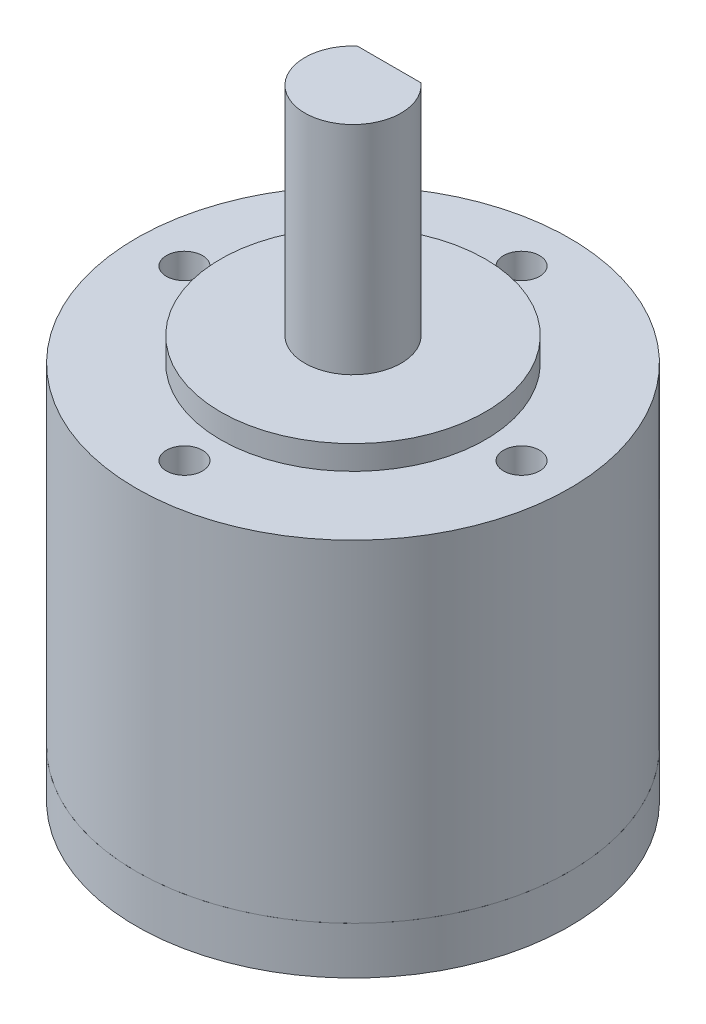
ISO-10303-21;
HEADER;
FILE_DESCRIPTION(('STEP AP214'),'2;1');
FILE_NAME('part.step','',(''),(''),'','','');
FILE_SCHEMA(('AUTOMOTIVE_DESIGN { 1 0 10303 214 1 1 1 1 }'));
ENDSEC;
DATA;
#1=APPLICATION_CONTEXT('core data for automotive mechanical design processes');
#2=APPLICATION_PROTOCOL_DEFINITION('international standard','automotive_design',2000,#1);
#3=PRODUCT_CONTEXT('',#1,'mechanical');
#4=PRODUCT('Part','Part','',(#3));
#5=PRODUCT_RELATED_PRODUCT_CATEGORY('part','',(#4));
#6=PRODUCT_DEFINITION_FORMATION('','',#4);
#7=PRODUCT_DEFINITION_CONTEXT('part definition',#1,'design');
#8=PRODUCT_DEFINITION('design','',#6,#7);
#9=PRODUCT_DEFINITION_SHAPE('','',#8);
#10=(LENGTH_UNIT() NAMED_UNIT(*) SI_UNIT(.MILLI.,.METRE.));
#11=(NAMED_UNIT(*) PLANE_ANGLE_UNIT() SI_UNIT($,.RADIAN.));
#12=(NAMED_UNIT(*) SI_UNIT($,.STERADIAN.) SOLID_ANGLE_UNIT());
#13=UNCERTAINTY_MEASURE_WITH_UNIT(LENGTH_MEASURE(1.E-05),#10,'distance_accuracy_value','');
#14=(GEOMETRIC_REPRESENTATION_CONTEXT(3) GLOBAL_UNCERTAINTY_ASSIGNED_CONTEXT((#13)) GLOBAL_UNIT_ASSIGNED_CONTEXT((#10,
#11,#12)) REPRESENTATION_CONTEXT('',''));
#15=CARTESIAN_POINT('',(0.,0.,0.));
#16=DIRECTION('',(0.,0.,1.));
#17=DIRECTION('',(1.,0.,0.));
#18=AXIS2_PLACEMENT_3D('',#15,#16,#17);
#19=CARTESIAN_POINT('',(0.,-17.7165,0.));
#20=DIRECTION('',(0.,1.,0.));
#21=DIRECTION('',(0.,0.,1.));
#22=AXIS2_PLACEMENT_3D('',#19,#20,#21);
#23=CYLINDRICAL_SURFACE('',#22,4.);
#24=CARTESIAN_POINT('',(0.,-17.7165,0.));
#25=DIRECTION('',(0.,1.,0.));
#26=DIRECTION('',(0.,0.,1.));
#27=AXIS2_PLACEMENT_3D('',#24,#25,#26);
#28=CIRCLE('',#27,4.);
#29=CARTESIAN_POINT('',(0.,-17.7165,4.));
#30=VERTEX_POINT('',#29);
#31=EDGE_CURVE('E80',#30,#30,#28,.T.);
#32=ORIENTED_EDGE('',*,*,#31,.F.);
#33=EDGE_LOOP('',(#32));
#34=FACE_BOUND('',#33,.T.);
#35=CARTESIAN_POINT('',(0.,-11.9665,0.));
#36=DIRECTION('',(0.,1.,0.));
#37=DIRECTION('',(0.,0.,1.));
#38=AXIS2_PLACEMENT_3D('',#35,#36,#37);
#39=CIRCLE('',#38,4.);
#40=CARTESIAN_POINT('',(0.,-11.9665,4.));
#41=VERTEX_POINT('',#40);
#42=EDGE_CURVE('E50',#41,#41,#39,.F.);
#43=ORIENTED_EDGE('',*,*,#42,.F.);
#44=EDGE_LOOP('',(#43));
#45=FACE_BOUND('',#44,.T.);
#46=ADVANCED_FACE('F46',(#34,#45),#23,.F.);
#47=CARTESIAN_POINT('',(0.,-17.7165,0.));
#48=DIRECTION('',(0.,1.,0.));
#49=DIRECTION('',(0.,0.,1.));
#50=AXIS2_PLACEMENT_3D('',#47,#48,#49);
#51=CYLINDRICAL_SURFACE('',#50,18.);
#52=CARTESIAN_POINT('',(0.,-17.7165,0.));
#53=DIRECTION('',(0.,-1.,0.));
#54=DIRECTION('',(0.,0.,-1.));
#55=AXIS2_PLACEMENT_3D('',#52,#53,#54);
#56=CIRCLE('',#55,18.);
#57=CARTESIAN_POINT('',(0.,-17.7165,-18.));
#58=VERTEX_POINT('',#57);
#59=EDGE_CURVE('E54',#58,#58,#56,.T.);
#60=ORIENTED_EDGE('',*,*,#59,.F.);
#61=EDGE_LOOP('',(#60));
#62=FACE_BOUND('',#61,.T.);
#63=CARTESIAN_POINT('',(0.,-13.7795,0.));
#64=DIRECTION('',(0.,-1.,0.));
#65=DIRECTION('',(0.,0.,-1.));
#66=AXIS2_PLACEMENT_3D('',#63,#64,#65);
#67=CIRCLE('',#66,18.);
#68=CARTESIAN_POINT('',(0.,-13.7795,-18.));
#69=VERTEX_POINT('',#68);
#70=EDGE_CURVE('E59',#69,#69,#67,.T.);
#71=ORIENTED_EDGE('',*,*,#70,.T.);
#72=EDGE_LOOP('',(#71));
#73=FACE_BOUND('',#72,.T.);
#74=ADVANCED_FACE('F48',(#62,#73),#51,.T.);
#75=CARTESIAN_POINT('',(0.,-17.7165,0.));
#76=DIRECTION('',(0.,-1.,0.));
#77=DIRECTION('',(0.,0.,-1.));
#78=AXIS2_PLACEMENT_3D('',#75,#76,#77);
#79=PLANE('',#78);
#80=ORIENTED_EDGE('',*,*,#31,.T.);
#81=EDGE_LOOP('',(#80));
#82=FACE_BOUND('',#81,.T.);
#83=CARTESIAN_POINT('',(0.,-17.7165,-14.));
#84=DIRECTION('',(0.,1.,0.));
#85=DIRECTION('',(0.,0.,1.));
#86=AXIS2_PLACEMENT_3D('',#83,#84,#85);
#87=CIRCLE('',#86,1.265);
#88=CARTESIAN_POINT('',(0.,-17.7165,-12.735));
#89=VERTEX_POINT('',#88);
#90=EDGE_CURVE('E68',#89,#89,#87,.T.);
#91=ORIENTED_EDGE('',*,*,#90,.T.);
#92=EDGE_LOOP('',(#91));
#93=FACE_BOUND('',#92,.T.);
#94=CARTESIAN_POINT('',(14.,-17.7165,0.));
#95=DIRECTION('',(0.,1.,0.));
#96=DIRECTION('',(0.,0.,1.));
#97=AXIS2_PLACEMENT_3D('',#94,#95,#96);
#98=CIRCLE('',#97,1.265);
#99=CARTESIAN_POINT('',(14.,-17.7165,1.265));
#100=VERTEX_POINT('',#99);
#101=EDGE_CURVE('E77',#100,#100,#98,.T.);
#102=ORIENTED_EDGE('',*,*,#101,.T.);
#103=EDGE_LOOP('',(#102));
#104=FACE_BOUND('',#103,.T.);
#105=CARTESIAN_POINT('',(0.,-17.7165,14.));
#106=DIRECTION('',(0.,1.,0.));
#107=DIRECTION('',(0.,0.,1.));
#108=AXIS2_PLACEMENT_3D('',#105,#106,#107);
#109=CIRCLE('',#108,1.265);
#110=CARTESIAN_POINT('',(0.,-17.7165,15.265));
#111=VERTEX_POINT('',#110);
#112=EDGE_CURVE('E88',#111,#111,#109,.T.);
#113=ORIENTED_EDGE('',*,*,#112,.T.);
#114=EDGE_LOOP('',(#113));
#115=FACE_BOUND('',#114,.T.);
#116=CARTESIAN_POINT('',(-14.,-17.7165,0.));
#117=DIRECTION('',(0.,1.,0.));
#118=DIRECTION('',(0.,0.,1.));
#119=AXIS2_PLACEMENT_3D('',#116,#117,#118);
#120=CIRCLE('',#119,1.265);
#121=CARTESIAN_POINT('',(-14.,-17.7165,1.265));
#122=VERTEX_POINT('',#121);
#123=EDGE_CURVE('E94',#122,#122,#120,.T.);
#124=ORIENTED_EDGE('',*,*,#123,.T.);
#125=EDGE_LOOP('',(#124));
#126=FACE_BOUND('',#125,.T.);
#127=ORIENTED_EDGE('',*,*,#59,.T.);
#128=EDGE_LOOP('',(#127));
#129=FACE_BOUND('',#128,.T.);
#130=ADVANCED_FACE('F141',(#82,#93,#104,#115,#126,#129),#79,.T.);
#131=CARTESIAN_POINT('',(0.,-13.7795,0.));
#132=DIRECTION('',(0.,-1.,0.));
#133=DIRECTION('',(0.,0.,-1.));
#134=AXIS2_PLACEMENT_3D('',#131,#132,#133);
#135=PLANE('',#134);
#136=CARTESIAN_POINT('',(0.,-13.7795,-14.));
#137=DIRECTION('',(0.,1.,0.));
#138=DIRECTION('',(0.,0.,1.));
#139=AXIS2_PLACEMENT_3D('',#136,#137,#138);
#140=CIRCLE('',#139,1.265);
#141=CARTESIAN_POINT('',(0.,-13.7795,-12.735));
#142=VERTEX_POINT('',#141);
#143=EDGE_CURVE('E72',#142,#142,#140,.T.);
#144=ORIENTED_EDGE('',*,*,#143,.F.);
#145=EDGE_LOOP('',(#144));
#146=FACE_BOUND('',#145,.T.);
#147=CARTESIAN_POINT('',(14.,-13.7795,0.));
#148=DIRECTION('',(0.,1.,0.));
#149=DIRECTION('',(0.,0.,1.));
#150=AXIS2_PLACEMENT_3D('',#147,#148,#149);
#151=CIRCLE('',#150,1.265);
#152=CARTESIAN_POINT('',(14.,-13.7795,1.265));
#153=VERTEX_POINT('',#152);
#154=EDGE_CURVE('E85',#153,#153,#151,.T.);
#155=ORIENTED_EDGE('',*,*,#154,.F.);
#156=EDGE_LOOP('',(#155));
#157=FACE_BOUND('',#156,.T.);
#158=CARTESIAN_POINT('',(0.,-13.7795,14.));
#159=DIRECTION('',(0.,1.,0.));
#160=DIRECTION('',(0.,0.,1.));
#161=AXIS2_PLACEMENT_3D('',#158,#159,#160);
#162=CIRCLE('',#161,1.265);
#163=CARTESIAN_POINT('',(0.,-13.7795,15.265));
#164=VERTEX_POINT('',#163);
#165=EDGE_CURVE('E91',#164,#164,#162,.T.);
#166=ORIENTED_EDGE('',*,*,#165,.F.);
#167=EDGE_LOOP('',(#166));
#168=FACE_BOUND('',#167,.T.);
#169=CARTESIAN_POINT('',(-14.,-13.7795,0.));
#170=DIRECTION('',(0.,1.,0.));
#171=DIRECTION('',(0.,0.,1.));
#172=AXIS2_PLACEMENT_3D('',#169,#170,#171);
#173=CIRCLE('',#172,1.265);
#174=CARTESIAN_POINT('',(-14.,-13.7795,1.265));
#175=VERTEX_POINT('',#174);
#176=EDGE_CURVE('E96',#175,#175,#173,.T.);
#177=ORIENTED_EDGE('',*,*,#176,.F.);
#178=EDGE_LOOP('',(#177));
#179=FACE_BOUND('',#178,.T.);
#180=CARTESIAN_POINT('',(0.,-13.7795,0.));
#181=DIRECTION('',(0.,1.,0.));
#182=DIRECTION('',(0.,0.,1.));
#183=AXIS2_PLACEMENT_3D('',#180,#181,#182);
#184=CIRCLE('',#183,10.9855);
#185=CARTESIAN_POINT('',(0.,-13.7795,10.9855));
#186=VERTEX_POINT('',#185);
#187=EDGE_CURVE('E11',#186,#186,#184,.T.);
#188=ORIENTED_EDGE('',*,*,#187,.F.);
#189=EDGE_LOOP('',(#188));
#190=FACE_BOUND('',#189,.T.);
#191=ORIENTED_EDGE('',*,*,#70,.F.);
#192=EDGE_LOOP('',(#191));
#193=FACE_BOUND('',#192,.T.);
#194=ADVANCED_FACE('F131',(#146,#157,#168,#179,#190,#193),#135,.F.);
#195=CARTESIAN_POINT('',(0.,-11.3665,0.));
#196=DIRECTION('',(0.,-1.,0.));
#197=DIRECTION('',(0.,0.,-1.));
#198=AXIS2_PLACEMENT_3D('',#195,#196,#197);
#199=CYLINDRICAL_SURFACE('',#198,10.9855);
#200=CARTESIAN_POINT('',(0.,-11.3665,0.));
#201=DIRECTION('',(0.,1.,0.));
#202=DIRECTION('',(0.,0.,1.));
#203=AXIS2_PLACEMENT_3D('',#200,#201,#202);
#204=CIRCLE('',#203,10.9855);
#205=CARTESIAN_POINT('',(0.,-11.3665,10.9855));
#206=VERTEX_POINT('',#205);
#207=EDGE_CURVE('E62',#206,#206,#204,.T.);
#208=ORIENTED_EDGE('',*,*,#207,.F.);
#209=EDGE_LOOP('',(#208));
#210=FACE_BOUND('',#209,.T.);
#211=ORIENTED_EDGE('',*,*,#187,.T.);
#212=EDGE_LOOP('',(#211));
#213=FACE_BOUND('',#212,.T.);
#214=ADVANCED_FACE('F120',(#210,#213),#199,.T.);
#215=CARTESIAN_POINT('',(0.,-11.3665,0.));
#216=DIRECTION('',(0.,1.,0.));
#217=DIRECTION('',(0.,0.,1.));
#218=AXIS2_PLACEMENT_3D('',#215,#216,#217);
#219=PLANE('',#218);
#220=CARTESIAN_POINT('',(0.,-11.3665,0.));
#221=DIRECTION('',(0.,1.,0.));
#222=DIRECTION('',(0.,0.,1.));
#223=AXIS2_PLACEMENT_3D('',#220,#221,#222);
#224=CIRCLE('',#223,4.75);
#225=CARTESIAN_POINT('',(0.,-11.3665,4.75));
#226=VERTEX_POINT('',#225);
#227=EDGE_CURVE('E108',#226,#226,#224,.T.);
#228=ORIENTED_EDGE('',*,*,#227,.F.);
#229=EDGE_LOOP('',(#228));
#230=FACE_BOUND('',#229,.T.);
#231=ORIENTED_EDGE('',*,*,#207,.T.);
#232=EDGE_LOOP('',(#231));
#233=FACE_BOUND('',#232,.T.);
#234=ADVANCED_FACE('F117',(#230,#233),#219,.T.);
#235=CARTESIAN_POINT('',(-14.,-17.7165,0.));
#236=DIRECTION('',(0.,1.,0.));
#237=DIRECTION('',(0.,0.,1.));
#238=AXIS2_PLACEMENT_3D('',#235,#236,#237);
#239=CYLINDRICAL_SURFACE('',#238,1.265);
#240=ORIENTED_EDGE('',*,*,#123,.F.);
#241=EDGE_LOOP('',(#240));
#242=FACE_BOUND('',#241,.T.);
#243=ORIENTED_EDGE('',*,*,#176,.T.);
#244=EDGE_LOOP('',(#243));
#245=FACE_BOUND('',#244,.T.);
#246=ADVANCED_FACE('F119',(#242,#245),#239,.F.);
#247=CARTESIAN_POINT('',(0.,-17.7165,14.));
#248=DIRECTION('',(0.,1.,0.));
#249=DIRECTION('',(0.,0.,1.));
#250=AXIS2_PLACEMENT_3D('',#247,#248,#249);
#251=CYLINDRICAL_SURFACE('',#250,1.265);
#252=ORIENTED_EDGE('',*,*,#112,.F.);
#253=EDGE_LOOP('',(#252));
#254=FACE_BOUND('',#253,.T.);
#255=ORIENTED_EDGE('',*,*,#165,.T.);
#256=EDGE_LOOP('',(#255));
#257=FACE_BOUND('',#256,.T.);
#258=ADVANCED_FACE('F127',(#254,#257),#251,.F.);
#259=CARTESIAN_POINT('',(14.,-17.7165,0.));
#260=DIRECTION('',(0.,1.,0.));
#261=DIRECTION('',(0.,0.,1.));
#262=AXIS2_PLACEMENT_3D('',#259,#260,#261);
#263=CYLINDRICAL_SURFACE('',#262,1.265);
#264=ORIENTED_EDGE('',*,*,#101,.F.);
#265=EDGE_LOOP('',(#264));
#266=FACE_BOUND('',#265,.T.);
#267=ORIENTED_EDGE('',*,*,#154,.T.);
#268=EDGE_LOOP('',(#267));
#269=FACE_BOUND('',#268,.T.);
#270=ADVANCED_FACE('F150',(#266,#269),#263,.F.);
#271=CARTESIAN_POINT('',(0.,-17.7165,-14.));
#272=DIRECTION('',(0.,1.,0.));
#273=DIRECTION('',(0.,0.,1.));
#274=AXIS2_PLACEMENT_3D('',#271,#272,#273);
#275=CYLINDRICAL_SURFACE('',#274,1.265);
#276=ORIENTED_EDGE('',*,*,#90,.F.);
#277=EDGE_LOOP('',(#276));
#278=FACE_BOUND('',#277,.T.);
#279=ORIENTED_EDGE('',*,*,#143,.T.);
#280=EDGE_LOOP('',(#279));
#281=FACE_BOUND('',#280,.T.);
#282=ADVANCED_FACE('F147',(#278,#281),#275,.F.);
#283=CARTESIAN_POINT('',(0.,-11.9665,0.));
#284=DIRECTION('',(0.,1.,0.));
#285=DIRECTION('',(0.,0.,1.));
#286=AXIS2_PLACEMENT_3D('',#283,#284,#285);
#287=PLANE('',#286);
#288=CARTESIAN_POINT('',(0.,-11.9665,0.));
#289=DIRECTION('',(0.,1.,0.));
#290=DIRECTION('',(0.,0.,1.));
#291=AXIS2_PLACEMENT_3D('',#288,#289,#290);
#292=CIRCLE('',#291,4.75);
#293=CARTESIAN_POINT('',(0.,-11.9665,4.75));
#294=VERTEX_POINT('',#293);
#295=EDGE_CURVE('E104',#294,#294,#292,.T.);
#296=ORIENTED_EDGE('',*,*,#295,.T.);
#297=EDGE_LOOP('',(#296));
#298=FACE_BOUND('',#297,.T.);
#299=ORIENTED_EDGE('',*,*,#42,.T.);
#300=EDGE_LOOP('',(#299));
#301=FACE_BOUND('',#300,.T.);
#302=ADVANCED_FACE('F149',(#298,#301),#287,.T.);
#303=CARTESIAN_POINT('',(0.,-11.9665,0.));
#304=DIRECTION('',(0.,1.,0.));
#305=DIRECTION('',(0.,0.,1.));
#306=AXIS2_PLACEMENT_3D('',#303,#304,#305);
#307=CYLINDRICAL_SURFACE('',#306,4.75);
#308=ORIENTED_EDGE('',*,*,#295,.F.);
#309=EDGE_LOOP('',(#308));
#310=FACE_BOUND('',#309,.T.);
#311=ORIENTED_EDGE('',*,*,#227,.T.);
#312=EDGE_LOOP('',(#311));
#313=FACE_BOUND('',#312,.T.);
#314=ADVANCED_FACE('F115',(#310,#313),#307,.F.);
#315=CLOSED_SHELL('',(#46,#74,#130,#194,#214,#234,#246,#258,#270,#282,#302,#314));
#316=MANIFOLD_SOLID_BREP('B2',#315);
#317=CARTESIAN_POINT('',(0.,13.7795,0.));
#318=DIRECTION('',(0.,-1.,0.));
#319=DIRECTION('',(0.,0.,-1.));
#320=AXIS2_PLACEMENT_3D('',#317,#318,#319);
#321=CYLINDRICAL_SURFACE('',#320,18.);
#322=CARTESIAN_POINT('',(0.,13.7795,0.));
#323=DIRECTION('',(0.,1.,0.));
#324=DIRECTION('',(0.,0.,1.));
#325=AXIS2_PLACEMENT_3D('',#322,#323,#324);
#326=CIRCLE('',#325,18.);
#327=CARTESIAN_POINT('',(0.,13.7795,18.));
#328=VERTEX_POINT('',#327);
#329=EDGE_CURVE('E300',#328,#328,#326,.T.);
#330=ORIENTED_EDGE('',*,*,#329,.F.);
#331=EDGE_LOOP('',(#330));
#332=FACE_BOUND('',#331,.T.);
#333=CARTESIAN_POINT('',(0.,-13.7795,0.));
#334=DIRECTION('',(0.,1.,0.));
#335=DIRECTION('',(0.,0.,1.));
#336=AXIS2_PLACEMENT_3D('',#333,#334,#335);
#337=CIRCLE('',#336,18.);
#338=CARTESIAN_POINT('',(0.,-13.7795,18.));
#339=VERTEX_POINT('',#338);
#340=EDGE_CURVE('E254',#339,#339,#337,.T.);
#341=ORIENTED_EDGE('',*,*,#340,.T.);
#342=EDGE_LOOP('',(#341));
#343=FACE_BOUND('',#342,.T.);
#344=ADVANCED_FACE('F251',(#332,#343),#321,.T.);
#345=CARTESIAN_POINT('',(0.,13.7795,0.));
#346=DIRECTION('',(0.,1.,0.));
#347=DIRECTION('',(0.,0.,1.));
#348=AXIS2_PLACEMENT_3D('',#345,#346,#347);
#349=PLANE('',#348);
#350=CARTESIAN_POINT('',(0.,13.7795,-14.));
#351=DIRECTION('',(0.,1.,0.));
#352=DIRECTION('',(0.,0.,1.));
#353=AXIS2_PLACEMENT_3D('',#350,#351,#352);
#354=CIRCLE('',#353,1.5);
#355=CARTESIAN_POINT('',(0.,13.7795,-12.5));
#356=VERTEX_POINT('',#355);
#357=EDGE_CURVE('E479',#356,#356,#354,.T.);
#358=ORIENTED_EDGE('',*,*,#357,.F.);
#359=EDGE_LOOP('',(#358));
#360=FACE_BOUND('',#359,.T.);
#361=CARTESIAN_POINT('',(-14.,13.7795,0.));
#362=DIRECTION('',(0.,1.,0.));
#363=DIRECTION('',(0.,0.,1.));
#364=AXIS2_PLACEMENT_3D('',#361,#362,#363);
#365=CIRCLE('',#364,1.5);
#366=CARTESIAN_POINT('',(-14.,13.7795,1.5));
#367=VERTEX_POINT('',#366);
#368=EDGE_CURVE('E473',#367,#367,#365,.T.);
#369=ORIENTED_EDGE('',*,*,#368,.F.);
#370=EDGE_LOOP('',(#369));
#371=FACE_BOUND('',#370,.T.);
#372=CARTESIAN_POINT('',(0.,13.7795,14.));
#373=DIRECTION('',(0.,1.,0.));
#374=DIRECTION('',(0.,0.,1.));
#375=AXIS2_PLACEMENT_3D('',#372,#373,#374);
#376=CIRCLE('',#375,1.5);
#377=CARTESIAN_POINT('',(0.,13.7795,15.5));
#378=VERTEX_POINT('',#377);
#379=EDGE_CURVE('E467',#378,#378,#376,.T.);
#380=ORIENTED_EDGE('',*,*,#379,.F.);
#381=EDGE_LOOP('',(#380));
#382=FACE_BOUND('',#381,.T.);
#383=CARTESIAN_POINT('',(14.,13.7795,0.));
#384=DIRECTION('',(0.,1.,0.));
#385=DIRECTION('',(0.,0.,1.));
#386=AXIS2_PLACEMENT_3D('',#383,#384,#385);
#387=CIRCLE('',#386,1.5);
#388=CARTESIAN_POINT('',(14.,13.7795,1.5));
#389=VERTEX_POINT('',#388);
#390=EDGE_CURVE('E460',#389,#389,#387,.T.);
#391=ORIENTED_EDGE('',*,*,#390,.F.);
#392=EDGE_LOOP('',(#391));
#393=FACE_BOUND('',#392,.T.);
#394=CARTESIAN_POINT('',(0.,13.7795,0.));
#395=DIRECTION('',(0.,1.,0.));
#396=DIRECTION('',(0.,0.,1.));
#397=AXIS2_PLACEMENT_3D('',#394,#395,#396);
#398=CIRCLE('',#397,11.);
#399=CARTESIAN_POINT('',(0.,13.7795,11.));
#400=VERTEX_POINT('',#399);
#401=EDGE_CURVE('E259',#400,#400,#398,.T.);
#402=ORIENTED_EDGE('',*,*,#401,.F.);
#403=EDGE_LOOP('',(#402));
#404=FACE_BOUND('',#403,.T.);
#405=ORIENTED_EDGE('',*,*,#329,.T.);
#406=EDGE_LOOP('',(#405));
#407=FACE_BOUND('',#406,.T.);
#408=ADVANCED_FACE('F311',(#360,#371,#382,#393,#404,#407),#349,.T.);
#409=CARTESIAN_POINT('',(0.,-13.7795,0.));
#410=DIRECTION('',(0.,1.,0.));
#411=DIRECTION('',(0.,0.,1.));
#412=AXIS2_PLACEMENT_3D('',#409,#410,#411);
#413=PLANE('',#412);
#414=CARTESIAN_POINT('',(0.,-13.7795,0.));
#415=DIRECTION('',(0.,-1.,0.));
#416=DIRECTION('',(0.,0.,-1.));
#417=AXIS2_PLACEMENT_3D('',#414,#415,#416);
#418=CIRCLE('',#417,11.178);
#419=CARTESIAN_POINT('',(0.,-13.7795,-11.178));
#420=VERTEX_POINT('',#419);
#421=EDGE_CURVE('E484',#420,#420,#418,.T.);
#422=ORIENTED_EDGE('',*,*,#421,.F.);
#423=EDGE_LOOP('',(#422));
#424=FACE_BOUND('',#423,.T.);
#425=CARTESIAN_POINT('',(0.,-13.7795,-14.));
#426=DIRECTION('',(0.,1.,0.));
#427=DIRECTION('',(0.,0.,1.));
#428=AXIS2_PLACEMENT_3D('',#425,#426,#427);
#429=CIRCLE('',#428,1.5);
#430=CARTESIAN_POINT('',(0.,-13.7795,-12.5));
#431=VERTEX_POINT('',#430);
#432=EDGE_CURVE('E284',#431,#431,#429,.T.);
#433=ORIENTED_EDGE('',*,*,#432,.T.);
#434=EDGE_LOOP('',(#433));
#435=FACE_BOUND('',#434,.T.);
#436=CARTESIAN_POINT('',(-14.,-13.7795,0.));
#437=DIRECTION('',(0.,1.,0.));
#438=DIRECTION('',(0.,0.,1.));
#439=AXIS2_PLACEMENT_3D('',#436,#437,#438);
#440=CIRCLE('',#439,1.5);
#441=CARTESIAN_POINT('',(-14.,-13.7795,1.5));
#442=VERTEX_POINT('',#441);
#443=EDGE_CURVE('E476',#442,#442,#440,.T.);
#444=ORIENTED_EDGE('',*,*,#443,.T.);
#445=EDGE_LOOP('',(#444));
#446=FACE_BOUND('',#445,.T.);
#447=CARTESIAN_POINT('',(0.,-13.7795,14.));
#448=DIRECTION('',(0.,1.,0.));
#449=DIRECTION('',(0.,0.,1.));
#450=AXIS2_PLACEMENT_3D('',#447,#448,#449);
#451=CIRCLE('',#450,1.5);
#452=CARTESIAN_POINT('',(0.,-13.7795,15.5));
#453=VERTEX_POINT('',#452);
#454=EDGE_CURVE('E470',#453,#453,#451,.T.);
#455=ORIENTED_EDGE('',*,*,#454,.T.);
#456=EDGE_LOOP('',(#455));
#457=FACE_BOUND('',#456,.T.);
#458=CARTESIAN_POINT('',(14.,-13.7795,0.));
#459=DIRECTION('',(0.,1.,0.));
#460=DIRECTION('',(0.,0.,1.));
#461=AXIS2_PLACEMENT_3D('',#458,#459,#460);
#462=CIRCLE('',#461,1.5);
#463=CARTESIAN_POINT('',(14.,-13.7795,1.5));
#464=VERTEX_POINT('',#463);
#465=EDGE_CURVE('E463',#464,#464,#462,.T.);
#466=ORIENTED_EDGE('',*,*,#465,.T.);
#467=EDGE_LOOP('',(#466));
#468=FACE_BOUND('',#467,.T.);
#469=ORIENTED_EDGE('',*,*,#340,.F.);
#470=EDGE_LOOP('',(#469));
#471=FACE_BOUND('',#470,.T.);
#472=ADVANCED_FACE('F308',(#424,#435,#446,#457,#468,#471),#413,.F.);
#473=CARTESIAN_POINT('',(0.,15.7795,0.));
#474=DIRECTION('',(0.,-1.,0.));
#475=DIRECTION('',(0.,0.,-1.));
#476=AXIS2_PLACEMENT_3D('',#473,#474,#475);
#477=CYLINDRICAL_SURFACE('',#476,11.);
#478=CARTESIAN_POINT('',(0.,15.7795,0.));
#479=DIRECTION('',(0.,1.,0.));
#480=DIRECTION('',(0.,0.,1.));
#481=AXIS2_PLACEMENT_3D('',#478,#479,#480);
#482=CIRCLE('',#481,11.);
#483=CARTESIAN_POINT('',(0.,15.7795,11.));
#484=VERTEX_POINT('',#483);
#485=EDGE_CURVE('E293',#484,#484,#482,.T.);
#486=ORIENTED_EDGE('',*,*,#485,.F.);
#487=EDGE_LOOP('',(#486));
#488=FACE_BOUND('',#487,.T.);
#489=ORIENTED_EDGE('',*,*,#401,.T.);
#490=EDGE_LOOP('',(#489));
#491=FACE_BOUND('',#490,.T.);
#492=ADVANCED_FACE('F310',(#488,#491),#477,.T.);
#493=CARTESIAN_POINT('',(0.,15.7795,0.));
#494=DIRECTION('',(0.,1.,0.));
#495=DIRECTION('',(0.,0.,1.));
#496=AXIS2_PLACEMENT_3D('',#493,#494,#495);
#497=PLANE('',#496);
#498=CARTESIAN_POINT('',(0.,15.7795,0.));
#499=DIRECTION('',(0.,1.,0.));
#500=DIRECTION('',(0.,0.,1.));
#501=AXIS2_PLACEMENT_3D('',#498,#499,#500);
#502=CIRCLE('',#501,4.);
#503=CARTESIAN_POINT('',(0.,15.7795,4.));
#504=VERTEX_POINT('',#503);
#505=EDGE_CURVE('E44',#504,#504,#502,.T.);
#506=ORIENTED_EDGE('',*,*,#505,.F.);
#507=EDGE_LOOP('',(#506));
#508=FACE_BOUND('',#507,.T.);
#509=ORIENTED_EDGE('',*,*,#485,.T.);
#510=EDGE_LOOP('',(#509));
#511=FACE_BOUND('',#510,.T.);
#512=ADVANCED_FACE('F317',(#508,#511),#497,.T.);
#513=CARTESIAN_POINT('',(0.,33.7795,0.));
#514=DIRECTION('',(0.,-1.,0.));
#515=DIRECTION('',(0.,0.,-1.));
#516=AXIS2_PLACEMENT_3D('',#513,#514,#515);
#517=CYLINDRICAL_SURFACE('',#516,4.);
#518=CARTESIAN_POINT('',(0.,33.7795,0.));
#519=DIRECTION('',(0.,1.,0.));
#520=DIRECTION('',(0.,0.,1.));
#521=AXIS2_PLACEMENT_3D('',#518,#519,#520);
#522=CIRCLE('',#521,4.);
#523=CARTESIAN_POINT('',(-2.64575131106459,33.7795,-3.));
#524=VERTEX_POINT('',#523);
#525=CARTESIAN_POINT('',(2.64575131106459,33.7795,-3.));
#526=VERTEX_POINT('',#525);
#527=EDGE_CURVE('E290',#524,#526,#522,.T.);
#528=ORIENTED_EDGE('',*,*,#527,.F.);
#529=DIRECTION('',(0.,1.,0.));
#530=VECTOR('',#529,1.);
#531=CARTESIAN_POINT('',(-2.64575131106459,18.7795,-3.));
#532=LINE('',#531,#530);
#533=CARTESIAN_POINT('',(-2.64575131106459,18.7795,-3.));
#534=VERTEX_POINT('',#533);
#535=EDGE_CURVE('E267',#534,#524,#532,.T.);
#536=ORIENTED_EDGE('',*,*,#535,.F.);
#537=CARTESIAN_POINT('',(0.,18.7795,0.));
#538=DIRECTION('',(0.,1.,0.));
#539=DIRECTION('',(0.,0.,1.));
#540=AXIS2_PLACEMENT_3D('',#537,#538,#539);
#541=CIRCLE('',#540,4.);
#542=CARTESIAN_POINT('',(2.64575131106459,18.7795,-3.));
#543=VERTEX_POINT('',#542);
#544=EDGE_CURVE('E283',#543,#534,#541,.T.);
#545=ORIENTED_EDGE('',*,*,#544,.F.);
#546=DIRECTION('',(0.,1.,0.));
#547=VECTOR('',#546,1.);
#548=CARTESIAN_POINT('',(2.64575131106459,18.7795,-3.));
#549=LINE('',#548,#547);
#550=EDGE_CURVE('E273',#543,#526,#549,.T.);
#551=ORIENTED_EDGE('',*,*,#550,.T.);
#552=EDGE_LOOP('',(#528,#536,#545,#551));
#553=FACE_BOUND('',#552,.T.);
#554=ORIENTED_EDGE('',*,*,#505,.T.);
#555=EDGE_LOOP('',(#554));
#556=FACE_BOUND('',#555,.T.);
#557=ADVANCED_FACE('F288',(#553,#556),#517,.T.);
#558=CARTESIAN_POINT('',(0.,33.7795,0.));
#559=DIRECTION('',(0.,1.,0.));
#560=DIRECTION('',(0.,0.,1.));
#561=AXIS2_PLACEMENT_3D('',#558,#559,#560);
#562=PLANE('',#561);
#563=DIRECTION('',(1.,0.,0.));
#564=VECTOR('',#563,1.);
#565=CARTESIAN_POINT('',(-2.64575131106459,33.7795,-3.));
#566=LINE('',#565,#564);
#567=EDGE_CURVE('E278',#524,#526,#566,.T.);
#568=ORIENTED_EDGE('',*,*,#567,.F.);
#569=ORIENTED_EDGE('',*,*,#527,.T.);
#570=EDGE_LOOP('',(#568,#569));
#571=FACE_BOUND('',#570,.T.);
#572=ADVANCED_FACE('F292',(#571),#562,.T.);
#573=CARTESIAN_POINT('',(-2.64575131106459,18.7795,-3.));
#574=DIRECTION('',(0.,0.,1.));
#575=DIRECTION('',(1.,0.,0.));
#576=AXIS2_PLACEMENT_3D('',#573,#574,#575);
#577=PLANE('',#576);
#578=ORIENTED_EDGE('',*,*,#567,.T.);
#579=ORIENTED_EDGE('',*,*,#550,.F.);
#580=DIRECTION('',(1.,0.,0.));
#581=VECTOR('',#580,1.);
#582=CARTESIAN_POINT('',(-2.64575131106459,18.7795,-3.));
#583=LINE('',#582,#581);
#584=EDGE_CURVE('E456',#534,#543,#583,.T.);
#585=ORIENTED_EDGE('',*,*,#584,.F.);
#586=ORIENTED_EDGE('',*,*,#535,.T.);
#587=EDGE_LOOP('',(#578,#579,#585,#586));
#588=FACE_BOUND('',#587,.T.);
#589=ADVANCED_FACE('F279',(#588),#577,.F.);
#590=CARTESIAN_POINT('',(0.,18.7795,0.));
#591=DIRECTION('',(0.,1.,0.));
#592=DIRECTION('',(0.,0.,1.));
#593=AXIS2_PLACEMENT_3D('',#590,#591,#592);
#594=PLANE('',#593);
#595=ORIENTED_EDGE('',*,*,#544,.T.);
#596=ORIENTED_EDGE('',*,*,#584,.T.);
#597=EDGE_LOOP('',(#595,#596));
#598=FACE_BOUND('',#597,.T.);
#599=ADVANCED_FACE('F340',(#598),#594,.T.);
#600=CARTESIAN_POINT('',(14.,-13.7795,0.));
#601=DIRECTION('',(0.,1.,0.));
#602=DIRECTION('',(0.,0.,1.));
#603=AXIS2_PLACEMENT_3D('',#600,#601,#602);
#604=CYLINDRICAL_SURFACE('',#603,1.5);
#605=ORIENTED_EDGE('',*,*,#465,.F.);
#606=EDGE_LOOP('',(#605));
#607=FACE_BOUND('',#606,.T.);
#608=ORIENTED_EDGE('',*,*,#390,.T.);
#609=EDGE_LOOP('',(#608));
#610=FACE_BOUND('',#609,.T.);
#611=ADVANCED_FACE('F345',(#607,#610),#604,.F.);
#612=CARTESIAN_POINT('',(0.,-13.7795,14.));
#613=DIRECTION('',(0.,1.,0.));
#614=DIRECTION('',(0.,0.,1.));
#615=AXIS2_PLACEMENT_3D('',#612,#613,#614);
#616=CYLINDRICAL_SURFACE('',#615,1.5);
#617=ORIENTED_EDGE('',*,*,#454,.F.);
#618=EDGE_LOOP('',(#617));
#619=FACE_BOUND('',#618,.T.);
#620=ORIENTED_EDGE('',*,*,#379,.T.);
#621=EDGE_LOOP('',(#620));
#622=FACE_BOUND('',#621,.T.);
#623=ADVANCED_FACE('F350',(#619,#622),#616,.F.);
#624=CARTESIAN_POINT('',(-14.,-13.7795,0.));
#625=DIRECTION('',(0.,1.,0.));
#626=DIRECTION('',(0.,0.,1.));
#627=AXIS2_PLACEMENT_3D('',#624,#625,#626);
#628=CYLINDRICAL_SURFACE('',#627,1.5);
#629=ORIENTED_EDGE('',*,*,#443,.F.);
#630=EDGE_LOOP('',(#629));
#631=FACE_BOUND('',#630,.T.);
#632=ORIENTED_EDGE('',*,*,#368,.T.);
#633=EDGE_LOOP('',(#632));
#634=FACE_BOUND('',#633,.T.);
#635=ADVANCED_FACE('F360',(#631,#634),#628,.F.);
#636=CARTESIAN_POINT('',(0.,-13.7795,-14.));
#637=DIRECTION('',(0.,1.,0.));
#638=DIRECTION('',(0.,0.,1.));
#639=AXIS2_PLACEMENT_3D('',#636,#637,#638);
#640=CYLINDRICAL_SURFACE('',#639,1.5);
#641=ORIENTED_EDGE('',*,*,#432,.F.);
#642=EDGE_LOOP('',(#641));
#643=FACE_BOUND('',#642,.T.);
#644=ORIENTED_EDGE('',*,*,#357,.T.);
#645=EDGE_LOOP('',(#644));
#646=FACE_BOUND('',#645,.T.);
#647=ADVANCED_FACE('F370',(#643,#646),#640,.F.);
#648=CARTESIAN_POINT('',(0.,6.2205,0.));
#649=DIRECTION('',(0.,-1.,0.));
#650=DIRECTION('',(0.,0.,-1.));
#651=AXIS2_PLACEMENT_3D('',#648,#649,#650);
#652=CYLINDRICAL_SURFACE('',#651,11.178);
#653=CARTESIAN_POINT('',(0.,6.2205,0.));
#654=DIRECTION('',(0.,-1.,0.));
#655=DIRECTION('',(0.,0.,-1.));
#656=AXIS2_PLACEMENT_3D('',#653,#654,#655);
#657=CIRCLE('',#656,11.178);
#658=CARTESIAN_POINT('',(0.,6.2205,-11.178));
#659=VERTEX_POINT('',#658);
#660=EDGE_CURVE('E464',#659,#659,#657,.T.);
#661=ORIENTED_EDGE('',*,*,#660,.F.);
#662=EDGE_LOOP('',(#661));
#663=FACE_BOUND('',#662,.T.);
#664=ORIENTED_EDGE('',*,*,#421,.T.);
#665=EDGE_LOOP('',(#664));
#666=FACE_BOUND('',#665,.T.);
#667=ADVANCED_FACE('F379',(#663,#666),#652,.F.);
#668=CARTESIAN_POINT('',(0.,6.2205,0.));
#669=DIRECTION('',(0.,-1.,0.));
#670=DIRECTION('',(0.,0.,-1.));
#671=AXIS2_PLACEMENT_3D('',#668,#669,#670);
#672=PLANE('',#671);
#673=ORIENTED_EDGE('',*,*,#660,.T.);
#674=EDGE_LOOP('',(#673));
#675=FACE_BOUND('',#674,.T.);
#676=ADVANCED_FACE('F394',(#675),#672,.T.);
#677=CLOSED_SHELL('',(#344,#408,#472,#492,#512,#557,#572,#589,#599,#611,#623,#635,#647,#667,#676));
#678=MANIFOLD_SOLID_BREP('B6',#677);
#679=ADVANCED_BREP_SHAPE_REPRESENTATION('',(#18,#316,#678),#14);
#680=SHAPE_DEFINITION_REPRESENTATION(#9,#679);
ENDSEC;
END-ISO-10303-21;
